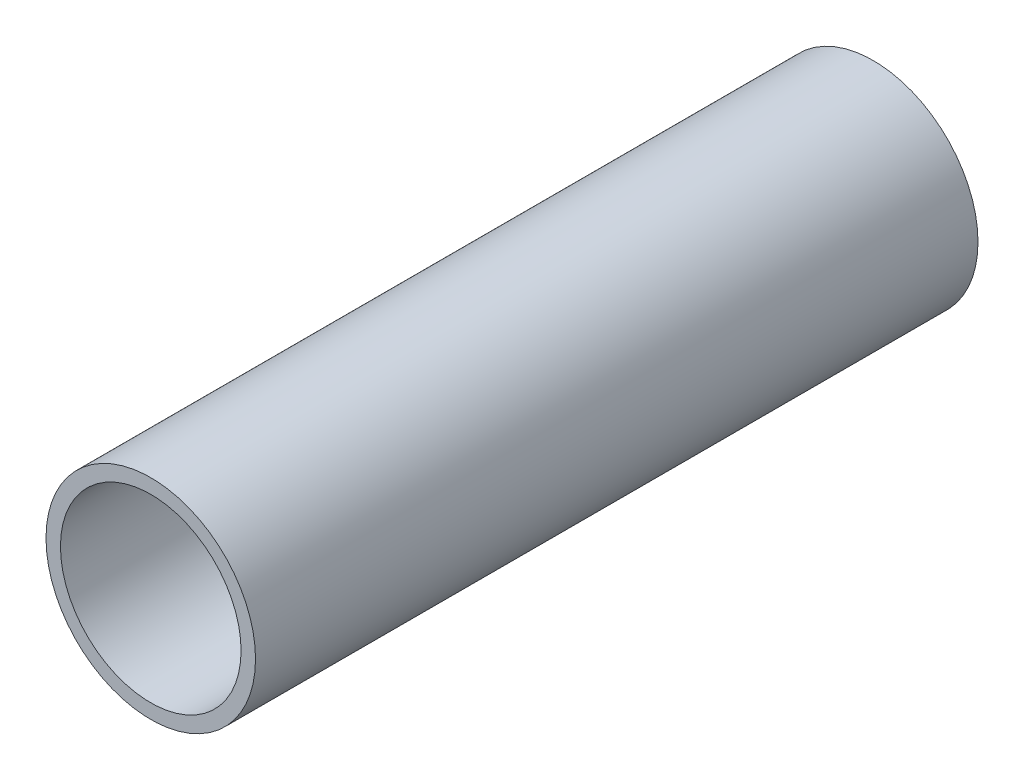
ISO-10303-21;
HEADER;
FILE_DESCRIPTION(('STEP AP214'),'2;1');
FILE_NAME('part.step','',(''),(''),'','','');
FILE_SCHEMA(('AUTOMOTIVE_DESIGN { 1 0 10303 214 1 1 1 1 }'));
ENDSEC;
DATA;
#1=APPLICATION_CONTEXT('core data for automotive mechanical design processes');
#2=APPLICATION_PROTOCOL_DEFINITION('international standard','automotive_design',2000,#1);
#3=PRODUCT_CONTEXT('',#1,'mechanical');
#4=PRODUCT('Part','Part','',(#3));
#5=PRODUCT_RELATED_PRODUCT_CATEGORY('part','',(#4));
#6=PRODUCT_DEFINITION_FORMATION('','',#4);
#7=PRODUCT_DEFINITION_CONTEXT('part definition',#1,'design');
#8=PRODUCT_DEFINITION('design','',#6,#7);
#9=PRODUCT_DEFINITION_SHAPE('','',#8);
#10=(LENGTH_UNIT() NAMED_UNIT(*) SI_UNIT(.MILLI.,.METRE.));
#11=(NAMED_UNIT(*) PLANE_ANGLE_UNIT() SI_UNIT($,.RADIAN.));
#12=(NAMED_UNIT(*) SI_UNIT($,.STERADIAN.) SOLID_ANGLE_UNIT());
#13=UNCERTAINTY_MEASURE_WITH_UNIT(LENGTH_MEASURE(1.E-05),#10,'distance_accuracy_value','');
#14=(GEOMETRIC_REPRESENTATION_CONTEXT(3) GLOBAL_UNCERTAINTY_ASSIGNED_CONTEXT((#13)) GLOBAL_UNIT_ASSIGNED_CONTEXT((#10,
#11,#12)) REPRESENTATION_CONTEXT('',''));
#15=CARTESIAN_POINT('',(0.,0.,0.));
#16=DIRECTION('',(0.,0.,1.));
#17=DIRECTION('',(1.,0.,0.));
#18=AXIS2_PLACEMENT_3D('',#15,#16,#17);
#19=CARTESIAN_POINT('',(0.,0.,100.));
#20=DIRECTION('',(0.,0.,1.));
#21=DIRECTION('',(1.,0.,0.));
#22=AXIS2_PLACEMENT_3D('',#19,#20,#21);
#23=PLANE('',#22);
#24=CARTESIAN_POINT('',(0.,0.,100.));
#25=DIRECTION('',(0.,0.,1.));
#26=DIRECTION('',(1.,0.,0.));
#27=AXIS2_PLACEMENT_3D('',#24,#25,#26);
#28=CIRCLE('',#27,14.5);
#29=CARTESIAN_POINT('',(14.5,0.,100.));
#30=VERTEX_POINT('',#29);
#31=EDGE_CURVE('E10',#30,#30,#28,.T.);
#32=ORIENTED_EDGE('',*,*,#31,.T.);
#33=EDGE_LOOP('',(#32));
#34=FACE_BOUND('',#33,.T.);
#35=CARTESIAN_POINT('',(0.,0.,100.));
#36=DIRECTION('',(0.,0.,1.));
#37=DIRECTION('',(1.,0.,0.));
#38=AXIS2_PLACEMENT_3D('',#35,#36,#37);
#39=CIRCLE('',#38,12.5);
#40=CARTESIAN_POINT('',(12.5,0.,100.));
#41=VERTEX_POINT('',#40);
#42=EDGE_CURVE('E54',#41,#41,#39,.T.);
#43=ORIENTED_EDGE('',*,*,#42,.F.);
#44=EDGE_LOOP('',(#43));
#45=FACE_BOUND('',#44,.T.);
#46=ADVANCED_FACE('F41',(#34,#45),#23,.T.);
#47=CARTESIAN_POINT('',(0.,0.,0.));
#48=DIRECTION('',(0.,0.,1.));
#49=DIRECTION('',(1.,0.,0.));
#50=AXIS2_PLACEMENT_3D('',#47,#48,#49);
#51=PLANE('',#50);
#52=CARTESIAN_POINT('',(0.,0.,0.));
#53=DIRECTION('',(0.,0.,1.));
#54=DIRECTION('',(1.,0.,0.));
#55=AXIS2_PLACEMENT_3D('',#52,#53,#54);
#56=CIRCLE('',#55,14.5);
#57=CARTESIAN_POINT('',(14.5,0.,0.));
#58=VERTEX_POINT('',#57);
#59=EDGE_CURVE('E45',#58,#58,#56,.T.);
#60=ORIENTED_EDGE('',*,*,#59,.F.);
#61=EDGE_LOOP('',(#60));
#62=FACE_BOUND('',#61,.T.);
#63=CARTESIAN_POINT('',(0.,0.,0.));
#64=DIRECTION('',(0.,0.,1.));
#65=DIRECTION('',(1.,0.,0.));
#66=AXIS2_PLACEMENT_3D('',#63,#64,#65);
#67=CIRCLE('',#66,12.5);
#68=CARTESIAN_POINT('',(12.5,0.,0.));
#69=VERTEX_POINT('',#68);
#70=EDGE_CURVE('E56',#69,#69,#67,.T.);
#71=ORIENTED_EDGE('',*,*,#70,.T.);
#72=EDGE_LOOP('',(#71));
#73=FACE_BOUND('',#72,.T.);
#74=ADVANCED_FACE('F68',(#62,#73),#51,.F.);
#75=CARTESIAN_POINT('',(0.,0.,100.));
#76=DIRECTION('',(0.,0.,-1.));
#77=DIRECTION('',(-1.,0.,0.));
#78=AXIS2_PLACEMENT_3D('',#75,#76,#77);
#79=CYLINDRICAL_SURFACE('',#78,14.5);
#80=ORIENTED_EDGE('',*,*,#31,.F.);
#81=EDGE_LOOP('',(#80));
#82=FACE_BOUND('',#81,.T.);
#83=ORIENTED_EDGE('',*,*,#59,.T.);
#84=EDGE_LOOP('',(#83));
#85=FACE_BOUND('',#84,.T.);
#86=ADVANCED_FACE('F43',(#82,#85),#79,.T.);
#87=CARTESIAN_POINT('',(0.,0.,100.));
#88=DIRECTION('',(0.,0.,-1.));
#89=DIRECTION('',(-1.,0.,0.));
#90=AXIS2_PLACEMENT_3D('',#87,#88,#89);
#91=CYLINDRICAL_SURFACE('',#90,12.5);
#92=ORIENTED_EDGE('',*,*,#42,.T.);
#93=EDGE_LOOP('',(#92));
#94=FACE_BOUND('',#93,.T.);
#95=ORIENTED_EDGE('',*,*,#70,.F.);
#96=EDGE_LOOP('',(#95));
#97=FACE_BOUND('',#96,.T.);
#98=ADVANCED_FACE('F64',(#94,#97),#91,.F.);
#99=CLOSED_SHELL('',(#46,#74,#86,#98));
#100=MANIFOLD_SOLID_BREP('B2',#99);
#101=ADVANCED_BREP_SHAPE_REPRESENTATION('',(#18,#100),#14);
#102=SHAPE_DEFINITION_REPRESENTATION(#9,#101);
ENDSEC;
END-ISO-10303-21;
